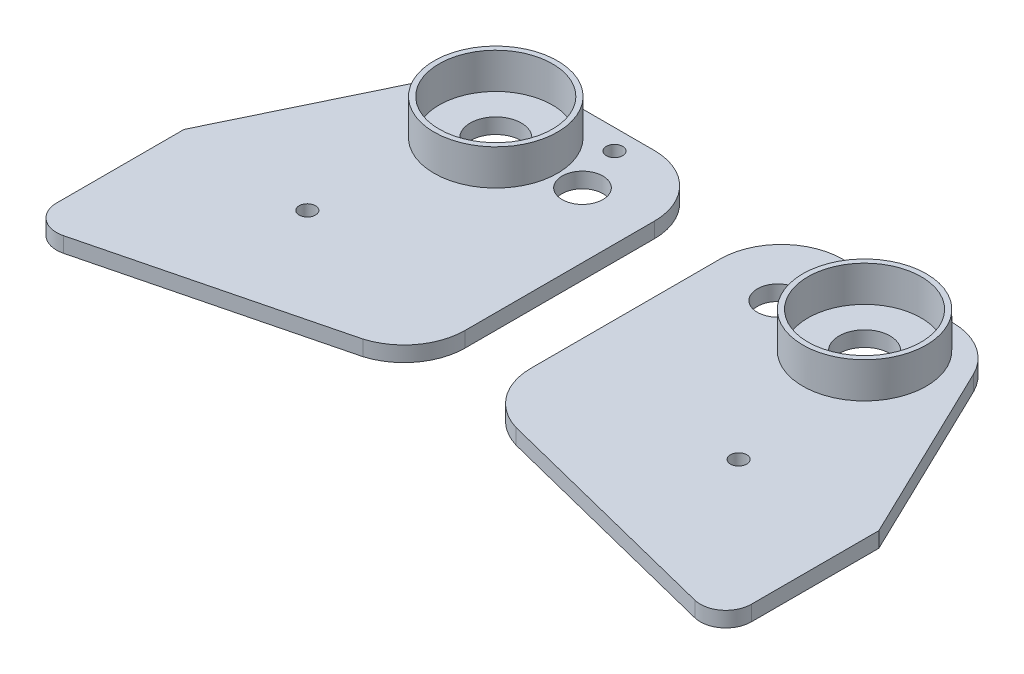
ISO-10303-21;
HEADER;
FILE_DESCRIPTION(('STEP AP214'),'2;1');
FILE_NAME('part.step','',(''),(''),'','','');
FILE_SCHEMA(('AUTOMOTIVE_DESIGN { 1 0 10303 214 1 1 1 1 }'));
ENDSEC;
DATA;
#1=APPLICATION_CONTEXT('core data for automotive mechanical design processes');
#2=APPLICATION_PROTOCOL_DEFINITION('international standard','automotive_design',2000,#1);
#3=PRODUCT_CONTEXT('',#1,'mechanical');
#4=PRODUCT('Part','Part','',(#3));
#5=PRODUCT_RELATED_PRODUCT_CATEGORY('part','',(#4));
#6=PRODUCT_DEFINITION_FORMATION('','',#4);
#7=PRODUCT_DEFINITION_CONTEXT('part definition',#1,'design');
#8=PRODUCT_DEFINITION('design','',#6,#7);
#9=PRODUCT_DEFINITION_SHAPE('','',#8);
#10=(LENGTH_UNIT() NAMED_UNIT(*) SI_UNIT(.MILLI.,.METRE.));
#11=(NAMED_UNIT(*) PLANE_ANGLE_UNIT() SI_UNIT($,.RADIAN.));
#12=(NAMED_UNIT(*) SI_UNIT($,.STERADIAN.) SOLID_ANGLE_UNIT());
#13=UNCERTAINTY_MEASURE_WITH_UNIT(LENGTH_MEASURE(1.E-05),#10,'distance_accuracy_value','');
#14=(GEOMETRIC_REPRESENTATION_CONTEXT(3) GLOBAL_UNCERTAINTY_ASSIGNED_CONTEXT((#13)) GLOBAL_UNIT_ASSIGNED_CONTEXT((#10,
#11,#12)) REPRESENTATION_CONTEXT('',''));
#15=CARTESIAN_POINT('',(0.,0.,0.));
#16=DIRECTION('',(0.,0.,1.));
#17=DIRECTION('',(1.,0.,0.));
#18=AXIS2_PLACEMENT_3D('',#15,#16,#17);
#19=CARTESIAN_POINT('',(40.042873565071,3.,-32.2165820237593));
#20=DIRECTION('',(0.,-1.,0.));
#21=DIRECTION('',(0.,0.,-1.));
#22=AXIS2_PLACEMENT_3D('',#19,#20,#21);
#23=PLANE('',#22);
#24=CARTESIAN_POINT('',(36.135474474537,3.,-30.8460471676936));
#25=DIRECTION('',(0.,1.,0.));
#26=DIRECTION('',(0.,0.,-1.));
#27=AXIS2_PLACEMENT_3D('',#24,#25,#26);
#28=CIRCLE('',#27,5.00000000000001);
#29=CARTESIAN_POINT('',(36.135474474537,3.,-35.8460471676936));
#30=VERTEX_POINT('',#29);
#31=EDGE_CURVE('E456',#30,#30,#28,.T.);
#32=ORIENTED_EDGE('',*,*,#31,.F.);
#33=EDGE_LOOP('',(#32));
#34=FACE_BOUND('',#33,.T.);
#35=CARTESIAN_POINT('',(36.135474474537,3.,-30.8460471676936));
#36=DIRECTION('',(0.,1.,0.));
#37=DIRECTION('',(0.,0.,1.));
#38=AXIS2_PLACEMENT_3D('',#35,#36,#37);
#39=CIRCLE('',#38,11.1);
#40=CARTESIAN_POINT('',(36.135474474537,3.,-19.7460471676936));
#41=VERTEX_POINT('',#40);
#42=EDGE_CURVE('E441',#41,#41,#39,.T.);
#43=ORIENTED_EDGE('',*,*,#42,.T.);
#44=EDGE_LOOP('',(#43));
#45=FACE_BOUND('',#44,.T.);
#46=ADVANCED_FACE('F49',(#34,#45),#23,.F.);
#47=CARTESIAN_POINT('',(22.2388305171554,3.,-40.2163712722587));
#48=DIRECTION('',(0.,1.,0.));
#49=DIRECTION('',(0.,0.,1.));
#50=AXIS2_PLACEMENT_3D('',#47,#48,#49);
#51=CIRCLE('',#50,1.6);
#52=CARTESIAN_POINT('',(22.2388305171554,3.,-38.6163712722587));
#53=VERTEX_POINT('',#52);
#54=EDGE_CURVE('E437',#53,#53,#51,.T.);
#55=ORIENTED_EDGE('',*,*,#54,.F.);
#56=EDGE_LOOP('',(#55));
#57=FACE_BOUND('',#56,.T.);
#58=CARTESIAN_POINT('',(36.135474474537,3.,-30.8460471676936));
#59=DIRECTION('',(0.,-1.,0.));
#60=DIRECTION('',(0.,0.,-1.));
#61=AXIS2_PLACEMENT_3D('',#58,#59,#60);
#62=CIRCLE('',#61,12.1);
#63=CARTESIAN_POINT('',(36.135474474537,3.,-42.9460471676936));
#64=VERTEX_POINT('',#63);
#65=EDGE_CURVE('E12',#64,#64,#62,.F.);
#66=ORIENTED_EDGE('',*,*,#65,.F.);
#67=EDGE_LOOP('',(#66));
#68=FACE_BOUND('',#67,.T.);
#69=CARTESIAN_POINT('',(40.042873565071,3.,-32.2165820237593));
#70=DIRECTION('',(0.,1.,0.));
#71=DIRECTION('',(0.,0.,-1.));
#72=AXIS2_PLACEMENT_3D('',#69,#70,#71);
#73=CIRCLE('',#72,12.000001);
#74=CARTESIAN_POINT('',(50.7602033417229,3.,-37.6146248596854));
#75=VERTEX_POINT('',#74);
#76=CARTESIAN_POINT('',(40.0427318384827,3.,-44.2165830229224));
#77=VERTEX_POINT('',#76);
#78=EDGE_CURVE('E194',#75,#77,#73,.T.);
#79=ORIENTED_EDGE('',*,*,#78,.T.);
#80=DIRECTION('',(-0.999999999929273,0.,1.18934820463317E-05));
#81=VECTOR('',#80,1.);
#82=CARTESIAN_POINT('',(18.4349291958282,3.,-44.2163260309096));
#83=LINE('',#82,#81);
#84=CARTESIAN_POINT('',(18.4349291958282,3.,-44.2163260309096));
#85=VERTEX_POINT('',#84);
#86=EDGE_CURVE('E117',#77,#85,#83,.T.);
#87=ORIENTED_EDGE('',*,*,#86,.T.);
#88=CARTESIAN_POINT('',(18.4350719174836,3.,-32.2163368976119));
#89=DIRECTION('',(0.,1.,0.));
#90=DIRECTION('',(0.,0.,-1.));
#91=AXIS2_PLACEMENT_3D('',#88,#89,#90);
#92=CIRCLE('',#91,11.9999883609759);
#93=CARTESIAN_POINT('',(6.43508355735918,3.,-32.2161939365774));
#94=VERTEX_POINT('',#93);
#95=EDGE_CURVE('E240',#85,#94,#92,.T.);
#96=ORIENTED_EDGE('',*,*,#95,.T.);
#97=DIRECTION('',(1.18627733153958E-05,0.,0.999999999929637));
#98=VECTOR('',#97,1.);
#99=CARTESIAN_POINT('',(6.43544644453697,3.,-1.69095353369363));
#100=LINE('',#99,#98);
#101=CARTESIAN_POINT('',(6.43544644453697,3.,-1.69095353369363));
#102=VERTEX_POINT('',#101);
#103=EDGE_CURVE('E236',#94,#102,#100,.T.);
#104=ORIENTED_EDGE('',*,*,#103,.T.);
#105=DIRECTION('',(1.19134310966162E-05,0.,0.999999999929035));
#106=VECTOR('',#105,1.);
#107=CARTESIAN_POINT('',(6.43544644453697,3.,-1.69095353369363));
#108=LINE('',#107,#106);
#109=CARTESIAN_POINT('',(6.43552431461504,3.,4.84537319138531));
#110=VERTEX_POINT('',#109);
#111=EDGE_CURVE('E238',#102,#110,#108,.T.);
#112=ORIENTED_EDGE('',*,*,#111,.T.);
#113=CARTESIAN_POINT('',(18.4355243137682,3.,4.84523062653266));
#114=DIRECTION('',(0.,1.,0.));
#115=DIRECTION('',(0.,0.,-1.));
#116=AXIS2_PLACEMENT_3D('',#113,#114,#115);
#117=CIRCLE('',#116,12.0000000000001);
#118=CARTESIAN_POINT('',(14.9998908917222,3.,16.3429009553132));
#119=VERTEX_POINT('',#118);
#120=EDGE_CURVE('E244',#110,#119,#117,.T.);
#121=ORIENTED_EDGE('',*,*,#120,.T.);
#122=DIRECTION('',(0.969769579192456,0.,0.244022464688983));
#123=VECTOR('',#122,1.);
#124=CARTESIAN_POINT('',(61.8646856411741,3.,28.1354576278246));
#125=LINE('',#124,#123);
#126=CARTESIAN_POINT('',(61.8646856411741,3.,28.1354576278246));
#127=VERTEX_POINT('',#126);
#128=EDGE_CURVE('E143',#119,#127,#125,.T.);
#129=ORIENTED_EDGE('',*,*,#128,.T.);
#130=CARTESIAN_POINT('',(63.084797964619,3.,23.2866097318623));
#131=DIRECTION('',(0.,1.,0.));
#132=DIRECTION('',(0.,0.,-1.));
#133=AXIS2_PLACEMENT_3D('',#130,#131,#132);
#134=CIRCLE('',#133,5.00000000000001);
#135=CARTESIAN_POINT('',(68.0847979636234,3.,23.2865099483779));
#136=VERTEX_POINT('',#135);
#137=EDGE_CURVE('E136',#127,#136,#134,.T.);
#138=ORIENTED_EDGE('',*,*,#137,.T.);
#139=DIRECTION('',(-1.99566968971164E-05,0.,-0.999999999800865));
#140=VECTOR('',#139,1.);
#141=CARTESIAN_POINT('',(68.0842992367222,3.,-1.70394331268686));
#142=LINE('',#141,#140);
#143=CARTESIAN_POINT('',(68.0842992367222,3.,-1.70394331268686));
#144=VERTEX_POINT('',#143);
#145=EDGE_CURVE('E141',#136,#144,#142,.T.);
#146=ORIENTED_EDGE('',*,*,#145,.T.);
#147=DIRECTION('',(-0.434503028481843,0.,-0.900670371578918));
#148=VECTOR('',#147,1.);
#149=CARTESIAN_POINT('',(50.7602033417229,3.,-37.6146248596854));
#150=LINE('',#149,#148);
#151=EDGE_CURVE('E67',#144,#75,#150,.T.);
#152=ORIENTED_EDGE('',*,*,#151,.T.);
#153=EDGE_LOOP('',(#79,#87,#96,#104,#112,#121,#129,#138,#146,#152));
#154=FACE_BOUND('',#153,.T.);
#155=CARTESIAN_POINT('',(42.260458862537,3.,-0.0416202926936254));
#156=DIRECTION('',(0.,1.,0.));
#157=DIRECTION('',(0.,0.,-1.));
#158=AXIS2_PLACEMENT_3D('',#155,#156,#157);
#159=CIRCLE('',#158,1.59999999999999);
#160=CARTESIAN_POINT('',(42.260458862537,3.,-1.64162029269362));
#161=VERTEX_POINT('',#160);
#162=EDGE_CURVE('E170',#161,#161,#159,.T.);
#163=ORIENTED_EDGE('',*,*,#162,.F.);
#164=EDGE_LOOP('',(#163));
#165=FACE_BOUND('',#164,.T.);
#166=CARTESIAN_POINT('',(19.135475969537,3.,-30.8419455666936));
#167=DIRECTION('',(0.,1.,0.));
#168=DIRECTION('',(0.,0.,-1.));
#169=AXIS2_PLACEMENT_3D('',#166,#167,#168);
#170=CIRCLE('',#169,4.00000000000001);
#171=CARTESIAN_POINT('',(19.135475969537,3.,-34.8419455666936));
#172=VERTEX_POINT('',#171);
#173=EDGE_CURVE('E464',#172,#172,#170,.T.);
#174=ORIENTED_EDGE('',*,*,#173,.F.);
#175=EDGE_LOOP('',(#174));
#176=FACE_BOUND('',#175,.T.);
#177=ADVANCED_FACE('F138',(#57,#68,#154,#165,#176),#23,.F.);
#178=CARTESIAN_POINT('',(40.042873565071,0.,-32.2165820237593));
#179=DIRECTION('',(0.,-1.,0.));
#180=DIRECTION('',(0.,0.,-1.));
#181=AXIS2_PLACEMENT_3D('',#178,#179,#180);
#182=PLANE('',#181);
#183=CARTESIAN_POINT('',(22.2388305171554,0.,-40.2163712722587));
#184=DIRECTION('',(0.,1.,0.));
#185=DIRECTION('',(0.,0.,1.));
#186=AXIS2_PLACEMENT_3D('',#183,#184,#185);
#187=CIRCLE('',#186,1.6);
#188=CARTESIAN_POINT('',(22.2388305171554,0.,-38.6163712722587));
#189=VERTEX_POINT('',#188);
#190=EDGE_CURVE('E434',#189,#189,#187,.T.);
#191=ORIENTED_EDGE('',*,*,#190,.T.);
#192=EDGE_LOOP('',(#191));
#193=FACE_BOUND('',#192,.T.);
#194=CARTESIAN_POINT('',(19.135475969537,0.,-30.8419455666936));
#195=DIRECTION('',(0.,1.,0.));
#196=DIRECTION('',(0.,0.,-1.));
#197=AXIS2_PLACEMENT_3D('',#194,#195,#196);
#198=CIRCLE('',#197,4.00000000000001);
#199=CARTESIAN_POINT('',(19.135475969537,0.,-34.8419455666936));
#200=VERTEX_POINT('',#199);
#201=EDGE_CURVE('E460',#200,#200,#198,.T.);
#202=ORIENTED_EDGE('',*,*,#201,.T.);
#203=EDGE_LOOP('',(#202));
#204=FACE_BOUND('',#203,.T.);
#205=CARTESIAN_POINT('',(40.042873565071,0.,-32.2165820237593));
#206=DIRECTION('',(0.,1.,0.));
#207=DIRECTION('',(0.,0.,-1.));
#208=AXIS2_PLACEMENT_3D('',#205,#206,#207);
#209=CIRCLE('',#208,12.000001);
#210=CARTESIAN_POINT('',(50.7602033417229,0.,-37.6146248596854));
#211=VERTEX_POINT('',#210);
#212=CARTESIAN_POINT('',(40.0427318384827,0.,-44.2165830229224));
#213=VERTEX_POINT('',#212);
#214=EDGE_CURVE('E165',#211,#213,#209,.T.);
#215=ORIENTED_EDGE('',*,*,#214,.F.);
#216=DIRECTION('',(-0.434503028481843,0.,-0.900670371578918));
#217=VECTOR('',#216,1.);
#218=CARTESIAN_POINT('',(50.7602033417229,0.,-37.6146248596854));
#219=LINE('',#218,#217);
#220=CARTESIAN_POINT('',(68.0842992367222,0.,-1.70394331268686));
#221=VERTEX_POINT('',#220);
#222=EDGE_CURVE('E108',#221,#211,#219,.T.);
#223=ORIENTED_EDGE('',*,*,#222,.F.);
#224=DIRECTION('',(-1.99566968971164E-05,0.,-0.999999999800865));
#225=VECTOR('',#224,1.);
#226=CARTESIAN_POINT('',(68.0842992367222,0.,-1.70394331268686));
#227=LINE('',#226,#225);
#228=CARTESIAN_POINT('',(68.0847979636234,0.,23.2865099483779));
#229=VERTEX_POINT('',#228);
#230=EDGE_CURVE('E102',#229,#221,#227,.T.);
#231=ORIENTED_EDGE('',*,*,#230,.F.);
#232=CARTESIAN_POINT('',(63.084797964619,0.,23.2866097318623));
#233=DIRECTION('',(0.,1.,0.));
#234=DIRECTION('',(0.,0.,-1.));
#235=AXIS2_PLACEMENT_3D('',#232,#233,#234);
#236=CIRCLE('',#235,5.00000000000001);
#237=CARTESIAN_POINT('',(61.8646856411741,0.,28.1354576278246));
#238=VERTEX_POINT('',#237);
#239=EDGE_CURVE('E152',#238,#229,#236,.T.);
#240=ORIENTED_EDGE('',*,*,#239,.F.);
#241=DIRECTION('',(0.969769579192456,0.,0.244022464688983));
#242=VECTOR('',#241,1.);
#243=CARTESIAN_POINT('',(61.8646856411741,0.,28.1354576278246));
#244=LINE('',#243,#242);
#245=CARTESIAN_POINT('',(14.9998908917222,0.,16.3429009553132));
#246=VERTEX_POINT('',#245);
#247=EDGE_CURVE('E185',#246,#238,#244,.T.);
#248=ORIENTED_EDGE('',*,*,#247,.F.);
#249=CARTESIAN_POINT('',(18.4355243137682,0.,4.84523062653266));
#250=DIRECTION('',(0.,1.,0.));
#251=DIRECTION('',(0.,0.,-1.));
#252=AXIS2_PLACEMENT_3D('',#249,#250,#251);
#253=CIRCLE('',#252,12.0000000000001);
#254=CARTESIAN_POINT('',(6.43552431461504,0.,4.84537319138531));
#255=VERTEX_POINT('',#254);
#256=EDGE_CURVE('E182',#255,#246,#253,.T.);
#257=ORIENTED_EDGE('',*,*,#256,.F.);
#258=DIRECTION('',(1.19134310966162E-05,0.,0.999999999929035));
#259=VECTOR('',#258,1.);
#260=CARTESIAN_POINT('',(6.43544644453697,0.,-1.69095353369363));
#261=LINE('',#260,#259);
#262=CARTESIAN_POINT('',(6.43544644453697,0.,-1.69095353369363));
#263=VERTEX_POINT('',#262);
#264=EDGE_CURVE('E179',#263,#255,#261,.T.);
#265=ORIENTED_EDGE('',*,*,#264,.F.);
#266=DIRECTION('',(1.18627733153958E-05,0.,0.999999999929637));
#267=VECTOR('',#266,1.);
#268=CARTESIAN_POINT('',(6.43544644453697,0.,-1.69095353369363));
#269=LINE('',#268,#267);
#270=CARTESIAN_POINT('',(6.43508355735918,0.,-32.2161939365774));
#271=VERTEX_POINT('',#270);
#272=EDGE_CURVE('E176',#271,#263,#269,.T.);
#273=ORIENTED_EDGE('',*,*,#272,.F.);
#274=CARTESIAN_POINT('',(18.4350719174836,0.,-32.2163368976119));
#275=DIRECTION('',(0.,1.,0.));
#276=DIRECTION('',(0.,0.,-1.));
#277=AXIS2_PLACEMENT_3D('',#274,#275,#276);
#278=CIRCLE('',#277,11.9999883609759);
#279=CARTESIAN_POINT('',(18.4349291958282,0.,-44.2163260309096));
#280=VERTEX_POINT('',#279);
#281=EDGE_CURVE('E173',#280,#271,#278,.T.);
#282=ORIENTED_EDGE('',*,*,#281,.F.);
#283=DIRECTION('',(-0.999999999929273,0.,1.18934820463317E-05));
#284=VECTOR('',#283,1.);
#285=CARTESIAN_POINT('',(18.4349291958282,0.,-44.2163260309096));
#286=LINE('',#285,#284);
#287=EDGE_CURVE('E169',#213,#280,#286,.T.);
#288=ORIENTED_EDGE('',*,*,#287,.F.);
#289=EDGE_LOOP('',(#215,#223,#231,#240,#248,#257,#265,#273,#282,#288));
#290=FACE_BOUND('',#289,.T.);
#291=CARTESIAN_POINT('',(42.260458862537,0.,-0.0416202926936254));
#292=DIRECTION('',(0.,1.,0.));
#293=DIRECTION('',(0.,0.,-1.));
#294=AXIS2_PLACEMENT_3D('',#291,#292,#293);
#295=CIRCLE('',#294,1.59999999999999);
#296=CARTESIAN_POINT('',(42.260458862537,0.,-1.64162029269362));
#297=VERTEX_POINT('',#296);
#298=EDGE_CURVE('E468',#297,#297,#295,.T.);
#299=ORIENTED_EDGE('',*,*,#298,.T.);
#300=EDGE_LOOP('',(#299));
#301=FACE_BOUND('',#300,.T.);
#302=CARTESIAN_POINT('',(36.135474474537,0.,-30.8460471676936));
#303=DIRECTION('',(0.,1.,0.));
#304=DIRECTION('',(0.,0.,-1.));
#305=AXIS2_PLACEMENT_3D('',#302,#303,#304);
#306=CIRCLE('',#305,5.00000000000001);
#307=CARTESIAN_POINT('',(36.135474474537,0.,-35.8460471676936));
#308=VERTEX_POINT('',#307);
#309=EDGE_CURVE('E455',#308,#308,#306,.T.);
#310=ORIENTED_EDGE('',*,*,#309,.T.);
#311=EDGE_LOOP('',(#310));
#312=FACE_BOUND('',#311,.T.);
#313=ADVANCED_FACE('F223',(#193,#204,#290,#301,#312),#182,.T.);
#314=CARTESIAN_POINT('',(40.042873565071,3.,-32.2165820237593));
#315=DIRECTION('',(0.,-1.,0.));
#316=DIRECTION('',(0.,0.,-1.));
#317=AXIS2_PLACEMENT_3D('',#314,#315,#316);
#318=CYLINDRICAL_SURFACE('',#317,12.000001);
#319=ORIENTED_EDGE('',*,*,#214,.T.);
#320=DIRECTION('',(0.,-1.,0.));
#321=VECTOR('',#320,1.);
#322=CARTESIAN_POINT('',(40.0427318384827,3.,-44.2165830229224));
#323=LINE('',#322,#321);
#324=EDGE_CURVE('E59',#77,#213,#323,.T.);
#325=ORIENTED_EDGE('',*,*,#324,.F.);
#326=ORIENTED_EDGE('',*,*,#78,.F.);
#327=DIRECTION('',(0.,-1.,0.));
#328=VECTOR('',#327,1.);
#329=CARTESIAN_POINT('',(50.7602033417229,3.,-37.6146248596854));
#330=LINE('',#329,#328);
#331=EDGE_CURVE('E161',#75,#211,#330,.T.);
#332=ORIENTED_EDGE('',*,*,#331,.T.);
#333=EDGE_LOOP('',(#319,#325,#326,#332));
#334=FACE_BOUND('',#333,.T.);
#335=ADVANCED_FACE('F51',(#334),#318,.T.);
#336=CARTESIAN_POINT('',(18.4349291958282,3.,-44.2163260309096));
#337=DIRECTION('',(1.18934820463317E-05,0.,0.999999999929273));
#338=DIRECTION('',(0.999999999929273,0.,-1.18934820463317E-05));
#339=AXIS2_PLACEMENT_3D('',#336,#337,#338);
#340=PLANE('',#339);
#341=ORIENTED_EDGE('',*,*,#287,.T.);
#342=DIRECTION('',(0.,-1.,0.));
#343=VECTOR('',#342,1.);
#344=CARTESIAN_POINT('',(18.4349291958282,3.,-44.2163260309096));
#345=LINE('',#344,#343);
#346=EDGE_CURVE('E213',#85,#280,#345,.T.);
#347=ORIENTED_EDGE('',*,*,#346,.F.);
#348=ORIENTED_EDGE('',*,*,#86,.F.);
#349=ORIENTED_EDGE('',*,*,#324,.T.);
#350=EDGE_LOOP('',(#341,#347,#348,#349));
#351=FACE_BOUND('',#350,.T.);
#352=ADVANCED_FACE('F218',(#351),#340,.F.);
#353=CARTESIAN_POINT('',(18.4350719174836,3.,-32.2163368976119));
#354=DIRECTION('',(0.,-1.,0.));
#355=DIRECTION('',(0.,0.,-1.));
#356=AXIS2_PLACEMENT_3D('',#353,#354,#355);
#357=CYLINDRICAL_SURFACE('',#356,11.9999883609759);
#358=ORIENTED_EDGE('',*,*,#281,.T.);
#359=DIRECTION('',(0.,-1.,0.));
#360=VECTOR('',#359,1.);
#361=CARTESIAN_POINT('',(6.43508355735918,3.,-32.2161939365774));
#362=LINE('',#361,#360);
#363=EDGE_CURVE('E209',#94,#271,#362,.T.);
#364=ORIENTED_EDGE('',*,*,#363,.F.);
#365=ORIENTED_EDGE('',*,*,#95,.F.);
#366=ORIENTED_EDGE('',*,*,#346,.T.);
#367=EDGE_LOOP('',(#358,#364,#365,#366));
#368=FACE_BOUND('',#367,.T.);
#369=ADVANCED_FACE('F230',(#368),#357,.T.);
#370=CARTESIAN_POINT('',(6.43544644453697,3.,-1.69095353369363));
#371=DIRECTION('',(0.999999999929035,0.,-1.19134310966162E-05));
#372=DIRECTION('',(-1.19134310966162E-05,0.,-0.999999999929035));
#373=AXIS2_PLACEMENT_3D('',#370,#371,#372);
#374=PLANE('',#373);
#375=ORIENTED_EDGE('',*,*,#264,.T.);
#376=DIRECTION('',(0.,-1.,0.));
#377=VECTOR('',#376,1.);
#378=CARTESIAN_POINT('',(6.43552431461504,3.,4.84537319138531));
#379=LINE('',#378,#377);
#380=EDGE_CURVE('E205',#110,#255,#379,.T.);
#381=ORIENTED_EDGE('',*,*,#380,.F.);
#382=ORIENTED_EDGE('',*,*,#111,.F.);
#383=ORIENTED_EDGE('',*,*,#103,.F.);
#384=ORIENTED_EDGE('',*,*,#363,.T.);
#385=ORIENTED_EDGE('',*,*,#272,.T.);
#386=EDGE_LOOP('',(#375,#381,#382,#383,#384,#385));
#387=FACE_BOUND('',#386,.T.);
#388=ADVANCED_FACE('F234',(#387),#374,.F.);
#389=CARTESIAN_POINT('',(18.4355243137682,3.,4.84523062653266));
#390=DIRECTION('',(0.,-1.,0.));
#391=DIRECTION('',(0.,0.,-1.));
#392=AXIS2_PLACEMENT_3D('',#389,#390,#391);
#393=CYLINDRICAL_SURFACE('',#392,12.0000000000001);
#394=ORIENTED_EDGE('',*,*,#256,.T.);
#395=DIRECTION('',(0.,-1.,0.));
#396=VECTOR('',#395,1.);
#397=CARTESIAN_POINT('',(14.9998908917222,3.,16.3429009553132));
#398=LINE('',#397,#396);
#399=EDGE_CURVE('E201',#119,#246,#398,.T.);
#400=ORIENTED_EDGE('',*,*,#399,.F.);
#401=ORIENTED_EDGE('',*,*,#120,.F.);
#402=ORIENTED_EDGE('',*,*,#380,.T.);
#403=EDGE_LOOP('',(#394,#400,#401,#402));
#404=FACE_BOUND('',#403,.T.);
#405=ADVANCED_FACE('F254',(#404),#393,.T.);
#406=CARTESIAN_POINT('',(61.8646856411741,3.,28.1354576278246));
#407=DIRECTION('',(0.244022464688983,0.,-0.969769579192457));
#408=DIRECTION('',(-0.969769579192457,0.,-0.244022464688983));
#409=AXIS2_PLACEMENT_3D('',#406,#407,#408);
#410=PLANE('',#409);
#411=ORIENTED_EDGE('',*,*,#247,.T.);
#412=DIRECTION('',(0.,-1.,0.));
#413=VECTOR('',#412,1.);
#414=CARTESIAN_POINT('',(61.8646856411741,3.,28.1354576278246));
#415=LINE('',#414,#413);
#416=EDGE_CURVE('E154',#127,#238,#415,.T.);
#417=ORIENTED_EDGE('',*,*,#416,.F.);
#418=ORIENTED_EDGE('',*,*,#128,.F.);
#419=ORIENTED_EDGE('',*,*,#399,.T.);
#420=EDGE_LOOP('',(#411,#417,#418,#419));
#421=FACE_BOUND('',#420,.T.);
#422=ADVANCED_FACE('F258',(#421),#410,.F.);
#423=CARTESIAN_POINT('',(63.084797964619,3.,23.2866097318623));
#424=DIRECTION('',(0.,-1.,0.));
#425=DIRECTION('',(0.,0.,-1.));
#426=AXIS2_PLACEMENT_3D('',#423,#424,#425);
#427=CYLINDRICAL_SURFACE('',#426,5.00000000000001);
#428=ORIENTED_EDGE('',*,*,#239,.T.);
#429=DIRECTION('',(0.,-1.,0.));
#430=VECTOR('',#429,1.);
#431=CARTESIAN_POINT('',(68.0847979636234,3.,23.2865099483779));
#432=LINE('',#431,#430);
#433=EDGE_CURVE('E149',#136,#229,#432,.T.);
#434=ORIENTED_EDGE('',*,*,#433,.F.);
#435=ORIENTED_EDGE('',*,*,#137,.F.);
#436=ORIENTED_EDGE('',*,*,#416,.T.);
#437=EDGE_LOOP('',(#428,#434,#435,#436));
#438=FACE_BOUND('',#437,.T.);
#439=ADVANCED_FACE('F150',(#438),#427,.T.);
#440=CARTESIAN_POINT('',(68.0842992367222,3.,-1.70394331268686));
#441=DIRECTION('',(-0.999999999800865,0.,1.99566968971164E-05));
#442=DIRECTION('',(1.99566968971164E-05,0.,0.999999999800865));
#443=AXIS2_PLACEMENT_3D('',#440,#441,#442);
#444=PLANE('',#443);
#445=ORIENTED_EDGE('',*,*,#230,.T.);
#446=DIRECTION('',(0.,-1.,0.));
#447=VECTOR('',#446,1.);
#448=CARTESIAN_POINT('',(68.0842992367222,3.,-1.70394331268686));
#449=LINE('',#448,#447);
#450=EDGE_CURVE('E155',#144,#221,#449,.T.);
#451=ORIENTED_EDGE('',*,*,#450,.F.);
#452=ORIENTED_EDGE('',*,*,#145,.F.);
#453=ORIENTED_EDGE('',*,*,#433,.T.);
#454=EDGE_LOOP('',(#445,#451,#452,#453));
#455=FACE_BOUND('',#454,.T.);
#456=ADVANCED_FACE('F157',(#455),#444,.F.);
#457=CARTESIAN_POINT('',(50.7602033417229,3.,-37.6146248596854));
#458=DIRECTION('',(-0.900670371578918,0.,0.434503028481843));
#459=DIRECTION('',(0.434503028481843,0.,0.900670371578918));
#460=AXIS2_PLACEMENT_3D('',#457,#458,#459);
#461=PLANE('',#460);
#462=ORIENTED_EDGE('',*,*,#222,.T.);
#463=ORIENTED_EDGE('',*,*,#331,.F.);
#464=ORIENTED_EDGE('',*,*,#151,.F.);
#465=ORIENTED_EDGE('',*,*,#450,.T.);
#466=EDGE_LOOP('',(#462,#463,#464,#465));
#467=FACE_BOUND('',#466,.T.);
#468=ADVANCED_FACE('F283',(#467),#461,.F.);
#469=CARTESIAN_POINT('',(42.260458862537,3.,-0.0416202926936254));
#470=DIRECTION('',(0.,-1.,0.));
#471=DIRECTION('',(0.,0.,-1.));
#472=AXIS2_PLACEMENT_3D('',#469,#470,#471);
#473=CYLINDRICAL_SURFACE('',#472,1.59999999999999);
#474=ORIENTED_EDGE('',*,*,#162,.T.);
#475=EDGE_LOOP('',(#474));
#476=FACE_BOUND('',#475,.T.);
#477=ORIENTED_EDGE('',*,*,#298,.F.);
#478=EDGE_LOOP('',(#477));
#479=FACE_BOUND('',#478,.T.);
#480=ADVANCED_FACE('F278',(#476,#479),#473,.F.);
#481=CARTESIAN_POINT('',(19.135475969537,3.,-30.8419455666936));
#482=DIRECTION('',(0.,-1.,0.));
#483=DIRECTION('',(0.,0.,-1.));
#484=AXIS2_PLACEMENT_3D('',#481,#482,#483);
#485=CYLINDRICAL_SURFACE('',#484,4.00000000000001);
#486=ORIENTED_EDGE('',*,*,#173,.T.);
#487=EDGE_LOOP('',(#486));
#488=FACE_BOUND('',#487,.T.);
#489=ORIENTED_EDGE('',*,*,#201,.F.);
#490=EDGE_LOOP('',(#489));
#491=FACE_BOUND('',#490,.T.);
#492=ADVANCED_FACE('F301',(#488,#491),#485,.F.);
#493=CARTESIAN_POINT('',(36.135474474537,3.,-30.8460471676936));
#494=DIRECTION('',(0.,-1.,0.));
#495=DIRECTION('',(0.,0.,-1.));
#496=AXIS2_PLACEMENT_3D('',#493,#494,#495);
#497=CYLINDRICAL_SURFACE('',#496,5.00000000000001);
#498=ORIENTED_EDGE('',*,*,#31,.T.);
#499=EDGE_LOOP('',(#498));
#500=FACE_BOUND('',#499,.T.);
#501=ORIENTED_EDGE('',*,*,#309,.F.);
#502=EDGE_LOOP('',(#501));
#503=FACE_BOUND('',#502,.T.);
#504=ADVANCED_FACE('F308',(#500,#503),#497,.F.);
#505=CARTESIAN_POINT('',(36.135474474537,10.,-30.8460471676936));
#506=DIRECTION('',(0.,1.,0.));
#507=DIRECTION('',(0.,0.,1.));
#508=AXIS2_PLACEMENT_3D('',#505,#506,#507);
#509=PLANE('',#508);
#510=CARTESIAN_POINT('',(36.135474474537,10.,-30.8460471676936));
#511=DIRECTION('',(0.,1.,0.));
#512=DIRECTION('',(0.,0.,1.));
#513=AXIS2_PLACEMENT_3D('',#510,#511,#512);
#514=CIRCLE('',#513,12.1);
#515=CARTESIAN_POINT('',(36.135474474537,10.,-18.7460471676936));
#516=VERTEX_POINT('',#515);
#517=EDGE_CURVE('E448',#516,#516,#514,.T.);
#518=ORIENTED_EDGE('',*,*,#517,.T.);
#519=EDGE_LOOP('',(#518));
#520=FACE_BOUND('',#519,.T.);
#521=CARTESIAN_POINT('',(36.135474474537,10.,-30.8460471676936));
#522=DIRECTION('',(0.,1.,0.));
#523=DIRECTION('',(0.,0.,1.));
#524=AXIS2_PLACEMENT_3D('',#521,#522,#523);
#525=CIRCLE('',#524,11.1);
#526=CARTESIAN_POINT('',(36.135474474537,10.,-19.7460471676936));
#527=VERTEX_POINT('',#526);
#528=EDGE_CURVE('E444',#527,#527,#525,.T.);
#529=ORIENTED_EDGE('',*,*,#528,.F.);
#530=EDGE_LOOP('',(#529));
#531=FACE_BOUND('',#530,.T.);
#532=ADVANCED_FACE('F315',(#520,#531),#509,.T.);
#533=CARTESIAN_POINT('',(36.135474474537,10.,-30.8460471676936));
#534=DIRECTION('',(0.,-1.,0.));
#535=DIRECTION('',(0.,0.,-1.));
#536=AXIS2_PLACEMENT_3D('',#533,#534,#535);
#537=CYLINDRICAL_SURFACE('',#536,12.1);
#538=ORIENTED_EDGE('',*,*,#517,.F.);
#539=EDGE_LOOP('',(#538));
#540=FACE_BOUND('',#539,.T.);
#541=ORIENTED_EDGE('',*,*,#65,.T.);
#542=EDGE_LOOP('',(#541));
#543=FACE_BOUND('',#542,.T.);
#544=ADVANCED_FACE('F323',(#540,#543),#537,.T.);
#545=CARTESIAN_POINT('',(36.135474474537,10.,-30.8460471676936));
#546=DIRECTION('',(0.,-1.,0.));
#547=DIRECTION('',(0.,0.,-1.));
#548=AXIS2_PLACEMENT_3D('',#545,#546,#547);
#549=CYLINDRICAL_SURFACE('',#548,11.1);
#550=ORIENTED_EDGE('',*,*,#528,.T.);
#551=EDGE_LOOP('',(#550));
#552=FACE_BOUND('',#551,.T.);
#553=ORIENTED_EDGE('',*,*,#42,.F.);
#554=EDGE_LOOP('',(#553));
#555=FACE_BOUND('',#554,.T.);
#556=ADVANCED_FACE('F331',(#552,#555),#549,.F.);
#557=CARTESIAN_POINT('',(22.2388305171554,0.,-40.2163712722587));
#558=DIRECTION('',(0.,1.,0.));
#559=DIRECTION('',(0.,0.,1.));
#560=AXIS2_PLACEMENT_3D('',#557,#558,#559);
#561=CYLINDRICAL_SURFACE('',#560,1.6);
#562=ORIENTED_EDGE('',*,*,#190,.F.);
#563=EDGE_LOOP('',(#562));
#564=FACE_BOUND('',#563,.T.);
#565=ORIENTED_EDGE('',*,*,#54,.T.);
#566=EDGE_LOOP('',(#565));
#567=FACE_BOUND('',#566,.T.);
#568=ADVANCED_FACE('F339',(#564,#567),#561,.F.);
#569=CLOSED_SHELL('',(#46,#177,#313,#335,#352,#369,#388,#405,#422,#439,#456,#468,#480,#492,#504,
#532,#544,#556,#568));
#570=MANIFOLD_SOLID_BREP('B2',#569);
#571=CARTESIAN_POINT('',(-18.4355243137682,3.,4.84523062653266));
#572=DIRECTION('',(0.,1.,0.));
#573=DIRECTION('',(0.,0.,1.));
#574=AXIS2_PLACEMENT_3D('',#571,#572,#573);
#575=PLANE('',#574);
#576=CARTESIAN_POINT('',(-36.135474474537,3.,-30.8460471676936));
#577=DIRECTION('',(0.,1.,0.));
#578=DIRECTION('',(0.,0.,1.));
#579=AXIS2_PLACEMENT_3D('',#576,#577,#578);
#580=CIRCLE('',#579,5.00000000000001);
#581=CARTESIAN_POINT('',(-36.135474474537,3.,-25.8460471676936));
#582=VERTEX_POINT('',#581);
#583=EDGE_CURVE('E617',#582,#582,#580,.T.);
#584=ORIENTED_EDGE('',*,*,#583,.F.);
#585=EDGE_LOOP('',(#584));
#586=FACE_BOUND('',#585,.T.);
#587=CARTESIAN_POINT('',(-36.135474474537,3.,-30.8460471676936));
#588=DIRECTION('',(0.,1.,0.));
#589=DIRECTION('',(0.,0.,1.));
#590=AXIS2_PLACEMENT_3D('',#587,#588,#589);
#591=CIRCLE('',#590,11.1);
#592=CARTESIAN_POINT('',(-36.135474474537,3.,-19.7460471676936));
#593=VERTEX_POINT('',#592);
#594=EDGE_CURVE('E47',#593,#593,#591,.F.);
#595=ORIENTED_EDGE('',*,*,#594,.F.);
#596=EDGE_LOOP('',(#595));
#597=FACE_BOUND('',#596,.T.);
#598=ADVANCED_FACE('F502',(#586,#597),#575,.T.);
#599=CARTESIAN_POINT('',(-22.2388305171554,3.,-40.2163712722587));
#600=DIRECTION('',(0.,1.,0.));
#601=DIRECTION('',(0.,0.,1.));
#602=AXIS2_PLACEMENT_3D('',#599,#600,#601);
#603=CIRCLE('',#602,1.6);
#604=CARTESIAN_POINT('',(-22.2388305171554,3.,-38.6163712722587));
#605=VERTEX_POINT('',#604);
#606=EDGE_CURVE('E862',#605,#605,#603,.T.);
#607=ORIENTED_EDGE('',*,*,#606,.F.);
#608=EDGE_LOOP('',(#607));
#609=FACE_BOUND('',#608,.T.);
#610=CARTESIAN_POINT('',(-36.135474474537,3.,-30.8460471676936));
#611=DIRECTION('',(0.,1.,0.));
#612=DIRECTION('',(0.,0.,1.));
#613=AXIS2_PLACEMENT_3D('',#610,#611,#612);
#614=CIRCLE('',#613,12.1);
#615=CARTESIAN_POINT('',(-36.135474474537,3.,-18.7460471676936));
#616=VERTEX_POINT('',#615);
#617=EDGE_CURVE('E869',#616,#616,#614,.T.);
#618=ORIENTED_EDGE('',*,*,#617,.F.);
#619=EDGE_LOOP('',(#618));
#620=FACE_BOUND('',#619,.T.);
#621=CARTESIAN_POINT('',(-19.135475969537,3.,-30.8419455666936));
#622=DIRECTION('',(0.,1.,0.));
#623=DIRECTION('',(0.,0.,1.));
#624=AXIS2_PLACEMENT_3D('',#621,#622,#623);
#625=CIRCLE('',#624,4.00000000000001);
#626=CARTESIAN_POINT('',(-19.135475969537,3.,-26.8419455666936));
#627=VERTEX_POINT('',#626);
#628=EDGE_CURVE('E882',#627,#627,#625,.T.);
#629=ORIENTED_EDGE('',*,*,#628,.F.);
#630=EDGE_LOOP('',(#629));
#631=FACE_BOUND('',#630,.T.);
#632=CARTESIAN_POINT('',(-18.4355243137682,3.,4.84523062653266));
#633=DIRECTION('',(0.,1.,0.));
#634=DIRECTION('',(0.,0.,1.));
#635=AXIS2_PLACEMENT_3D('',#632,#633,#634);
#636=CIRCLE('',#635,12.);
#637=CARTESIAN_POINT('',(-14.9998908917222,3.,16.3429009553132));
#638=VERTEX_POINT('',#637);
#639=CARTESIAN_POINT('',(-6.43552431461504,3.,4.84537319138531));
#640=VERTEX_POINT('',#639);
#641=EDGE_CURVE('E632',#638,#640,#636,.T.);
#642=ORIENTED_EDGE('',*,*,#641,.T.);
#643=DIRECTION('',(1.19134310966162E-05,0.,-0.999999999929035));
#644=VECTOR('',#643,1.);
#645=CARTESIAN_POINT('',(-6.43544644453697,3.,-1.69095353369363));
#646=LINE('',#645,#644);
#647=CARTESIAN_POINT('',(-6.43544644453697,3.,-1.69095353369363));
#648=VERTEX_POINT('',#647);
#649=EDGE_CURVE('E569',#640,#648,#646,.T.);
#650=ORIENTED_EDGE('',*,*,#649,.T.);
#651=DIRECTION('',(1.18627733153958E-05,0.,-0.999999999929637));
#652=VECTOR('',#651,1.);
#653=CARTESIAN_POINT('',(-6.43544644453697,3.,-1.69095353369363));
#654=LINE('',#653,#652);
#655=CARTESIAN_POINT('',(-6.43508355735917,3.,-32.2161939365774));
#656=VERTEX_POINT('',#655);
#657=EDGE_CURVE('E666',#648,#656,#654,.T.);
#658=ORIENTED_EDGE('',*,*,#657,.T.);
#659=CARTESIAN_POINT('',(-18.4350719174835,3.,-32.2163368976119));
#660=DIRECTION('',(0.,1.,0.));
#661=DIRECTION('',(0.,0.,1.));
#662=AXIS2_PLACEMENT_3D('',#659,#660,#661);
#663=CIRCLE('',#662,11.9999883609759);
#664=CARTESIAN_POINT('',(-18.4349291958282,3.,-44.2163260309096));
#665=VERTEX_POINT('',#664);
#666=EDGE_CURVE('E663',#656,#665,#663,.T.);
#667=ORIENTED_EDGE('',*,*,#666,.T.);
#668=DIRECTION('',(-0.999999999929273,0.,-1.18934820463317E-05));
#669=VECTOR('',#668,1.);
#670=CARTESIAN_POINT('',(-18.4349291958282,3.,-44.2163260309096));
#671=LINE('',#670,#669);
#672=CARTESIAN_POINT('',(-40.0427318384827,3.,-44.2165830229224));
#673=VERTEX_POINT('',#672);
#674=EDGE_CURVE('E665',#665,#673,#671,.T.);
#675=ORIENTED_EDGE('',*,*,#674,.T.);
#676=CARTESIAN_POINT('',(-40.042873565071,3.,-32.2165820237593));
#677=DIRECTION('',(0.,1.,0.));
#678=DIRECTION('',(0.,0.,1.));
#679=AXIS2_PLACEMENT_3D('',#676,#677,#678);
#680=CIRCLE('',#679,12.000001);
#681=CARTESIAN_POINT('',(-50.7602033417229,3.,-37.6146248596853));
#682=VERTEX_POINT('',#681);
#683=EDGE_CURVE('E668',#673,#682,#680,.T.);
#684=ORIENTED_EDGE('',*,*,#683,.T.);
#685=DIRECTION('',(-0.434503028481843,0.,0.900670371578919));
#686=VECTOR('',#685,1.);
#687=CARTESIAN_POINT('',(-50.7602033417229,3.,-37.6146248596853));
#688=LINE('',#687,#686);
#689=CARTESIAN_POINT('',(-68.0842992367222,3.,-1.70394331268685));
#690=VERTEX_POINT('',#689);
#691=EDGE_CURVE('E595',#682,#690,#688,.T.);
#692=ORIENTED_EDGE('',*,*,#691,.T.);
#693=DIRECTION('',(-1.99566968971164E-05,0.,0.999999999800865));
#694=VECTOR('',#693,1.);
#695=CARTESIAN_POINT('',(-68.0842992367222,3.,-1.70394331268685));
#696=LINE('',#695,#694);
#697=CARTESIAN_POINT('',(-68.0847979636233,3.,23.2865099483779));
#698=VERTEX_POINT('',#697);
#699=EDGE_CURVE('E588',#690,#698,#696,.T.);
#700=ORIENTED_EDGE('',*,*,#699,.T.);
#701=CARTESIAN_POINT('',(-63.084797964619,3.,23.2866097318624));
#702=DIRECTION('',(0.,1.,0.));
#703=DIRECTION('',(0.,0.,1.));
#704=AXIS2_PLACEMENT_3D('',#701,#702,#703);
#705=CIRCLE('',#704,5.00000000000001);
#706=CARTESIAN_POINT('',(-61.8646856411741,3.,28.1354576278246));
#707=VERTEX_POINT('',#706);
#708=EDGE_CURVE('E593',#698,#707,#705,.T.);
#709=ORIENTED_EDGE('',*,*,#708,.T.);
#710=DIRECTION('',(0.969769579192457,0.,-0.244022464688983));
#711=VECTOR('',#710,1.);
#712=CARTESIAN_POINT('',(-61.8646856411741,3.,28.1354576278246));
#713=LINE('',#712,#711);
#714=EDGE_CURVE('E519',#707,#638,#713,.T.);
#715=ORIENTED_EDGE('',*,*,#714,.T.);
#716=EDGE_LOOP('',(#642,#650,#658,#667,#675,#684,#692,#700,#709,#715));
#717=FACE_BOUND('',#716,.T.);
#718=CARTESIAN_POINT('',(-42.260458862537,3.,-0.0416202926936254));
#719=DIRECTION('',(0.,1.,0.));
#720=DIRECTION('',(0.,0.,1.));
#721=AXIS2_PLACEMENT_3D('',#718,#719,#720);
#722=CIRCLE('',#721,1.59999999999999);
#723=CARTESIAN_POINT('',(-42.260458862537,3.,1.55837970730637));
#724=VERTEX_POINT('',#723);
#725=EDGE_CURVE('E876',#724,#724,#722,.T.);
#726=ORIENTED_EDGE('',*,*,#725,.F.);
#727=EDGE_LOOP('',(#726));
#728=FACE_BOUND('',#727,.T.);
#729=ADVANCED_FACE('F590',(#609,#620,#631,#717,#728),#575,.T.);
#730=CARTESIAN_POINT('',(-18.4355243137682,0.,4.84523062653266));
#731=DIRECTION('',(0.,1.,0.));
#732=DIRECTION('',(0.,0.,1.));
#733=AXIS2_PLACEMENT_3D('',#730,#731,#732);
#734=PLANE('',#733);
#735=CARTESIAN_POINT('',(-22.2388305171554,0.,-40.2163712722587));
#736=DIRECTION('',(0.,1.,0.));
#737=DIRECTION('',(0.,0.,1.));
#738=AXIS2_PLACEMENT_3D('',#735,#736,#737);
#739=CIRCLE('',#738,1.6);
#740=CARTESIAN_POINT('',(-22.2388305171554,0.,-38.6163712722587));
#741=VERTEX_POINT('',#740);
#742=EDGE_CURVE('E859',#741,#741,#739,.T.);
#743=ORIENTED_EDGE('',*,*,#742,.T.);
#744=EDGE_LOOP('',(#743));
#745=FACE_BOUND('',#744,.T.);
#746=CARTESIAN_POINT('',(-18.4355243137682,0.,4.84523062653266));
#747=DIRECTION('',(0.,1.,0.));
#748=DIRECTION('',(0.,0.,1.));
#749=AXIS2_PLACEMENT_3D('',#746,#747,#748);
#750=CIRCLE('',#749,12.);
#751=CARTESIAN_POINT('',(-14.9998908917222,0.,16.3429009553132));
#752=VERTEX_POINT('',#751);
#753=CARTESIAN_POINT('',(-6.43552431461504,0.,4.84537319138531));
#754=VERTEX_POINT('',#753);
#755=EDGE_CURVE('E613',#752,#754,#750,.T.);
#756=ORIENTED_EDGE('',*,*,#755,.F.);
#757=DIRECTION('',(0.969769579192457,0.,-0.244022464688983));
#758=VECTOR('',#757,1.);
#759=CARTESIAN_POINT('',(-61.8646856411741,0.,28.1354576278246));
#760=LINE('',#759,#758);
#761=CARTESIAN_POINT('',(-61.8646856411741,0.,28.1354576278246));
#762=VERTEX_POINT('',#761);
#763=EDGE_CURVE('E560',#762,#752,#760,.T.);
#764=ORIENTED_EDGE('',*,*,#763,.F.);
#765=CARTESIAN_POINT('',(-63.084797964619,0.,23.2866097318624));
#766=DIRECTION('',(0.,1.,0.));
#767=DIRECTION('',(0.,0.,1.));
#768=AXIS2_PLACEMENT_3D('',#765,#766,#767);
#769=CIRCLE('',#768,5.00000000000001);
#770=CARTESIAN_POINT('',(-68.0847979636233,0.,23.2865099483779));
#771=VERTEX_POINT('',#770);
#772=EDGE_CURVE('E554',#771,#762,#769,.T.);
#773=ORIENTED_EDGE('',*,*,#772,.F.);
#774=DIRECTION('',(-1.99566968971164E-05,0.,0.999999999800865));
#775=VECTOR('',#774,1.);
#776=CARTESIAN_POINT('',(-68.0842992367222,0.,-1.70394331268685));
#777=LINE('',#776,#775);
#778=CARTESIAN_POINT('',(-68.0842992367222,0.,-1.70394331268685));
#779=VERTEX_POINT('',#778);
#780=EDGE_CURVE('E603',#779,#771,#777,.T.);
#781=ORIENTED_EDGE('',*,*,#780,.F.);
#782=DIRECTION('',(-0.434503028481843,0.,0.900670371578919));
#783=VECTOR('',#782,1.);
#784=CARTESIAN_POINT('',(-50.7602033417229,0.,-37.6146248596853));
#785=LINE('',#784,#783);
#786=CARTESIAN_POINT('',(-50.7602033417229,0.,-37.6146248596853));
#787=VERTEX_POINT('',#786);
#788=EDGE_CURVE('E627',#787,#779,#785,.T.);
#789=ORIENTED_EDGE('',*,*,#788,.F.);
#790=CARTESIAN_POINT('',(-40.042873565071,0.,-32.2165820237593));
#791=DIRECTION('',(0.,1.,0.));
#792=DIRECTION('',(0.,0.,1.));
#793=AXIS2_PLACEMENT_3D('',#790,#791,#792);
#794=CIRCLE('',#793,12.000001);
#795=CARTESIAN_POINT('',(-40.0427318384827,0.,-44.2165830229224));
#796=VERTEX_POINT('',#795);
#797=EDGE_CURVE('E625',#796,#787,#794,.T.);
#798=ORIENTED_EDGE('',*,*,#797,.F.);
#799=DIRECTION('',(-0.999999999929273,0.,-1.18934820463317E-05));
#800=VECTOR('',#799,1.);
#801=CARTESIAN_POINT('',(-18.4349291958282,0.,-44.2163260309096));
#802=LINE('',#801,#800);
#803=CARTESIAN_POINT('',(-18.4349291958282,0.,-44.2163260309096));
#804=VERTEX_POINT('',#803);
#805=EDGE_CURVE('E623',#804,#796,#802,.T.);
#806=ORIENTED_EDGE('',*,*,#805,.F.);
#807=CARTESIAN_POINT('',(-18.4350719174835,0.,-32.2163368976119));
#808=DIRECTION('',(0.,1.,0.));
#809=DIRECTION('',(0.,0.,1.));
#810=AXIS2_PLACEMENT_3D('',#807,#808,#809);
#811=CIRCLE('',#810,11.9999883609759);
#812=CARTESIAN_POINT('',(-6.43508355735917,0.,-32.2161939365774));
#813=VERTEX_POINT('',#812);
#814=EDGE_CURVE('E621',#813,#804,#811,.T.);
#815=ORIENTED_EDGE('',*,*,#814,.F.);
#816=DIRECTION('',(1.18627733153958E-05,0.,-0.999999999929637));
#817=VECTOR('',#816,1.);
#818=CARTESIAN_POINT('',(-6.43544644453697,0.,-1.69095353369363));
#819=LINE('',#818,#817);
#820=CARTESIAN_POINT('',(-6.43544644453697,0.,-1.69095353369363));
#821=VERTEX_POINT('',#820);
#822=EDGE_CURVE('E619',#821,#813,#819,.T.);
#823=ORIENTED_EDGE('',*,*,#822,.F.);
#824=DIRECTION('',(1.19134310966162E-05,0.,-0.999999999929035));
#825=VECTOR('',#824,1.);
#826=CARTESIAN_POINT('',(-6.43544644453697,0.,-1.69095353369363));
#827=LINE('',#826,#825);
#828=EDGE_CURVE('E616',#754,#821,#827,.T.);
#829=ORIENTED_EDGE('',*,*,#828,.F.);
#830=EDGE_LOOP('',(#756,#764,#773,#781,#789,#798,#806,#815,#823,#829));
#831=FACE_BOUND('',#830,.T.);
#832=CARTESIAN_POINT('',(-36.135474474537,0.,-30.8460471676936));
#833=DIRECTION('',(0.,1.,0.));
#834=DIRECTION('',(0.,0.,1.));
#835=AXIS2_PLACEMENT_3D('',#832,#833,#834);
#836=CIRCLE('',#835,5.00000000000001);
#837=CARTESIAN_POINT('',(-36.135474474537,0.,-25.8460471676936));
#838=VERTEX_POINT('',#837);
#839=EDGE_CURVE('E885',#838,#838,#836,.T.);
#840=ORIENTED_EDGE('',*,*,#839,.T.);
#841=EDGE_LOOP('',(#840));
#842=FACE_BOUND('',#841,.T.);
#843=CARTESIAN_POINT('',(-19.135475969537,0.,-30.8419455666936));
#844=DIRECTION('',(0.,1.,0.));
#845=DIRECTION('',(0.,0.,1.));
#846=AXIS2_PLACEMENT_3D('',#843,#844,#845);
#847=CIRCLE('',#846,4.00000000000001);
#848=CARTESIAN_POINT('',(-19.135475969537,0.,-26.8419455666936));
#849=VERTEX_POINT('',#848);
#850=EDGE_CURVE('E879',#849,#849,#847,.T.);
#851=ORIENTED_EDGE('',*,*,#850,.T.);
#852=EDGE_LOOP('',(#851));
#853=FACE_BOUND('',#852,.T.);
#854=CARTESIAN_POINT('',(-42.260458862537,0.,-0.0416202926936254));
#855=DIRECTION('',(0.,1.,0.));
#856=DIRECTION('',(0.,0.,1.));
#857=AXIS2_PLACEMENT_3D('',#854,#855,#856);
#858=CIRCLE('',#857,1.59999999999999);
#859=CARTESIAN_POINT('',(-42.260458862537,0.,1.55837970730637));
#860=VERTEX_POINT('',#859);
#861=EDGE_CURVE('E873',#860,#860,#858,.T.);
#862=ORIENTED_EDGE('',*,*,#861,.T.);
#863=EDGE_LOOP('',(#862));
#864=FACE_BOUND('',#863,.T.);
#865=ADVANCED_FACE('F654',(#745,#831,#842,#853,#864),#734,.F.);
#866=CARTESIAN_POINT('',(-18.4355243137682,3.,4.84523062653266));
#867=DIRECTION('',(0.,-1.,0.));
#868=DIRECTION('',(0.,0.,-1.));
#869=AXIS2_PLACEMENT_3D('',#866,#867,#868);
#870=CYLINDRICAL_SURFACE('',#869,12.);
#871=ORIENTED_EDGE('',*,*,#755,.T.);
#872=DIRECTION('',(0.,-1.,0.));
#873=VECTOR('',#872,1.);
#874=CARTESIAN_POINT('',(-6.43552431461504,3.,4.84537319138531));
#875=LINE('',#874,#873);
#876=EDGE_CURVE('E511',#640,#754,#875,.T.);
#877=ORIENTED_EDGE('',*,*,#876,.F.);
#878=ORIENTED_EDGE('',*,*,#641,.F.);
#879=DIRECTION('',(0.,-1.,0.));
#880=VECTOR('',#879,1.);
#881=CARTESIAN_POINT('',(-14.9998908917222,3.,16.3429009553132));
#882=LINE('',#881,#880);
#883=EDGE_CURVE('E609',#638,#752,#882,.T.);
#884=ORIENTED_EDGE('',*,*,#883,.T.);
#885=EDGE_LOOP('',(#871,#877,#878,#884));
#886=FACE_BOUND('',#885,.T.);
#887=ADVANCED_FACE('F504',(#886),#870,.T.);
#888=CARTESIAN_POINT('',(-6.43544644453697,3.,-1.69095353369363));
#889=DIRECTION('',(-0.999999999929637,0.,-1.18627733153958E-05));
#890=DIRECTION('',(-1.18627733153958E-05,0.,0.999999999929637));
#891=AXIS2_PLACEMENT_3D('',#888,#889,#890);
#892=PLANE('',#891);
#893=ORIENTED_EDGE('',*,*,#822,.T.);
#894=DIRECTION('',(0.,-1.,0.));
#895=VECTOR('',#894,1.);
#896=CARTESIAN_POINT('',(-6.43508355735917,3.,-32.2161939365774));
#897=LINE('',#896,#895);
#898=EDGE_CURVE('E645',#656,#813,#897,.T.);
#899=ORIENTED_EDGE('',*,*,#898,.F.);
#900=ORIENTED_EDGE('',*,*,#657,.F.);
#901=ORIENTED_EDGE('',*,*,#649,.F.);
#902=ORIENTED_EDGE('',*,*,#876,.T.);
#903=ORIENTED_EDGE('',*,*,#828,.T.);
#904=EDGE_LOOP('',(#893,#899,#900,#901,#902,#903));
#905=FACE_BOUND('',#904,.T.);
#906=ADVANCED_FACE('F648',(#905),#892,.F.);
#907=CARTESIAN_POINT('',(-18.4350719174835,3.,-32.2163368976119));
#908=DIRECTION('',(0.,-1.,0.));
#909=DIRECTION('',(0.,0.,-1.));
#910=AXIS2_PLACEMENT_3D('',#907,#908,#909);
#911=CYLINDRICAL_SURFACE('',#910,11.9999883609759);
#912=ORIENTED_EDGE('',*,*,#814,.T.);
#913=DIRECTION('',(0.,-1.,0.));
#914=VECTOR('',#913,1.);
#915=CARTESIAN_POINT('',(-18.4349291958282,3.,-44.2163260309096));
#916=LINE('',#915,#914);
#917=EDGE_CURVE('E642',#665,#804,#916,.T.);
#918=ORIENTED_EDGE('',*,*,#917,.F.);
#919=ORIENTED_EDGE('',*,*,#666,.F.);
#920=ORIENTED_EDGE('',*,*,#898,.T.);
#921=EDGE_LOOP('',(#912,#918,#919,#920));
#922=FACE_BOUND('',#921,.T.);
#923=ADVANCED_FACE('F661',(#922),#911,.T.);
#924=CARTESIAN_POINT('',(-18.4349291958282,3.,-44.2163260309096));
#925=DIRECTION('',(-1.18934820463317E-05,0.,0.999999999929273));
#926=DIRECTION('',(0.999999999929273,0.,1.18934820463317E-05));
#927=AXIS2_PLACEMENT_3D('',#924,#925,#926);
#928=PLANE('',#927);
#929=ORIENTED_EDGE('',*,*,#805,.T.);
#930=DIRECTION('',(0.,-1.,0.));
#931=VECTOR('',#930,1.);
#932=CARTESIAN_POINT('',(-40.0427318384827,3.,-44.2165830229224));
#933=LINE('',#932,#931);
#934=EDGE_CURVE('E639',#673,#796,#933,.T.);
#935=ORIENTED_EDGE('',*,*,#934,.F.);
#936=ORIENTED_EDGE('',*,*,#674,.F.);
#937=ORIENTED_EDGE('',*,*,#917,.T.);
#938=EDGE_LOOP('',(#929,#935,#936,#937));
#939=FACE_BOUND('',#938,.T.);
#940=ADVANCED_FACE('F683',(#939),#928,.F.);
#941=CARTESIAN_POINT('',(-40.042873565071,3.,-32.2165820237593));
#942=DIRECTION('',(0.,-1.,0.));
#943=DIRECTION('',(0.,0.,-1.));
#944=AXIS2_PLACEMENT_3D('',#941,#942,#943);
#945=CYLINDRICAL_SURFACE('',#944,12.000001);
#946=ORIENTED_EDGE('',*,*,#797,.T.);
#947=DIRECTION('',(0.,-1.,0.));
#948=VECTOR('',#947,1.);
#949=CARTESIAN_POINT('',(-50.7602033417229,3.,-37.6146248596853));
#950=LINE('',#949,#948);
#951=EDGE_CURVE('E636',#682,#787,#950,.T.);
#952=ORIENTED_EDGE('',*,*,#951,.F.);
#953=ORIENTED_EDGE('',*,*,#683,.F.);
#954=ORIENTED_EDGE('',*,*,#934,.T.);
#955=EDGE_LOOP('',(#946,#952,#953,#954));
#956=FACE_BOUND('',#955,.T.);
#957=ADVANCED_FACE('F677',(#956),#945,.T.);
#958=CARTESIAN_POINT('',(-50.7602033417229,3.,-37.6146248596853));
#959=DIRECTION('',(0.900670371578918,0.,0.434503028481842));
#960=DIRECTION('',(0.434503028481843,0.,-0.900670371578919));
#961=AXIS2_PLACEMENT_3D('',#958,#959,#960);
#962=PLANE('',#961);
#963=ORIENTED_EDGE('',*,*,#788,.T.);
#964=DIRECTION('',(0.,-1.,0.));
#965=VECTOR('',#964,1.);
#966=CARTESIAN_POINT('',(-68.0842992367222,3.,-1.70394331268685));
#967=LINE('',#966,#965);
#968=EDGE_CURVE('E604',#690,#779,#967,.T.);
#969=ORIENTED_EDGE('',*,*,#968,.F.);
#970=ORIENTED_EDGE('',*,*,#691,.F.);
#971=ORIENTED_EDGE('',*,*,#951,.T.);
#972=EDGE_LOOP('',(#963,#969,#970,#971));
#973=FACE_BOUND('',#972,.T.);
#974=ADVANCED_FACE('F681',(#973),#962,.F.);
#975=CARTESIAN_POINT('',(-68.0842992367222,3.,-1.70394331268685));
#976=DIRECTION('',(0.999999999800865,0.,1.99566968971164E-05));
#977=DIRECTION('',(1.99566968971164E-05,0.,-0.999999999800865));
#978=AXIS2_PLACEMENT_3D('',#975,#976,#977);
#979=PLANE('',#978);
#980=ORIENTED_EDGE('',*,*,#780,.T.);
#981=DIRECTION('',(0.,-1.,0.));
#982=VECTOR('',#981,1.);
#983=CARTESIAN_POINT('',(-68.0847979636233,3.,23.2865099483779));
#984=LINE('',#983,#982);
#985=EDGE_CURVE('E600',#698,#771,#984,.T.);
#986=ORIENTED_EDGE('',*,*,#985,.F.);
#987=ORIENTED_EDGE('',*,*,#699,.F.);
#988=ORIENTED_EDGE('',*,*,#968,.T.);
#989=EDGE_LOOP('',(#980,#986,#987,#988));
#990=FACE_BOUND('',#989,.T.);
#991=ADVANCED_FACE('F601',(#990),#979,.F.);
#992=CARTESIAN_POINT('',(-63.084797964619,3.,23.2866097318624));
#993=DIRECTION('',(0.,-1.,0.));
#994=DIRECTION('',(0.,0.,-1.));
#995=AXIS2_PLACEMENT_3D('',#992,#993,#994);
#996=CYLINDRICAL_SURFACE('',#995,5.00000000000001);
#997=ORIENTED_EDGE('',*,*,#772,.T.);
#998=DIRECTION('',(0.,-1.,0.));
#999=VECTOR('',#998,1.);
#1000=CARTESIAN_POINT('',(-61.8646856411741,3.,28.1354576278246));
#1001=LINE('',#1000,#999);
#1002=EDGE_CURVE('E605',#707,#762,#1001,.T.);
#1003=ORIENTED_EDGE('',*,*,#1002,.F.);
#1004=ORIENTED_EDGE('',*,*,#708,.F.);
#1005=ORIENTED_EDGE('',*,*,#985,.T.);
#1006=EDGE_LOOP('',(#997,#1003,#1004,#1005));
#1007=FACE_BOUND('',#1006,.T.);
#1008=ADVANCED_FACE('F607',(#1007),#996,.T.);
#1009=CARTESIAN_POINT('',(-61.8646856411741,3.,28.1354576278246));
#1010=DIRECTION('',(-0.244022464688983,0.,-0.969769579192456));
#1011=DIRECTION('',(-0.969769579192457,0.,0.244022464688983));
#1012=AXIS2_PLACEMENT_3D('',#1009,#1010,#1011);
#1013=PLANE('',#1012);
#1014=ORIENTED_EDGE('',*,*,#763,.T.);
#1015=ORIENTED_EDGE('',*,*,#883,.F.);
#1016=ORIENTED_EDGE('',*,*,#714,.F.);
#1017=ORIENTED_EDGE('',*,*,#1002,.T.);
#1018=EDGE_LOOP('',(#1014,#1015,#1016,#1017));
#1019=FACE_BOUND('',#1018,.T.);
#1020=ADVANCED_FACE('F708',(#1019),#1013,.F.);
#1021=CARTESIAN_POINT('',(-36.135474474537,3.,-30.8460471676936));
#1022=DIRECTION('',(0.,-1.,0.));
#1023=DIRECTION('',(0.,0.,-1.));
#1024=AXIS2_PLACEMENT_3D('',#1021,#1022,#1023);
#1025=CYLINDRICAL_SURFACE('',#1024,5.00000000000001);
#1026=ORIENTED_EDGE('',*,*,#583,.T.);
#1027=EDGE_LOOP('',(#1026));
#1028=FACE_BOUND('',#1027,.T.);
#1029=ORIENTED_EDGE('',*,*,#839,.F.);
#1030=EDGE_LOOP('',(#1029));
#1031=FACE_BOUND('',#1030,.T.);
#1032=ADVANCED_FACE('F703',(#1028,#1031),#1025,.F.);
#1033=CARTESIAN_POINT('',(-19.135475969537,3.,-30.8419455666936));
#1034=DIRECTION('',(0.,-1.,0.));
#1035=DIRECTION('',(0.,0.,-1.));
#1036=AXIS2_PLACEMENT_3D('',#1033,#1034,#1035);
#1037=CYLINDRICAL_SURFACE('',#1036,4.00000000000001);
#1038=ORIENTED_EDGE('',*,*,#628,.T.);
#1039=EDGE_LOOP('',(#1038));
#1040=FACE_BOUND('',#1039,.T.);
#1041=ORIENTED_EDGE('',*,*,#850,.F.);
#1042=EDGE_LOOP('',(#1041));
#1043=FACE_BOUND('',#1042,.T.);
#1044=ADVANCED_FACE('F738',(#1040,#1043),#1037,.F.);
#1045=CARTESIAN_POINT('',(-42.260458862537,3.,-0.0416202926936254));
#1046=DIRECTION('',(0.,-1.,0.));
#1047=DIRECTION('',(0.,0.,-1.));
#1048=AXIS2_PLACEMENT_3D('',#1045,#1046,#1047);
#1049=CYLINDRICAL_SURFACE('',#1048,1.59999999999999);
#1050=ORIENTED_EDGE('',*,*,#725,.T.);
#1051=EDGE_LOOP('',(#1050));
#1052=FACE_BOUND('',#1051,.T.);
#1053=ORIENTED_EDGE('',*,*,#861,.F.);
#1054=EDGE_LOOP('',(#1053));
#1055=FACE_BOUND('',#1054,.T.);
#1056=ADVANCED_FACE('F745',(#1052,#1055),#1049,.F.);
#1057=CARTESIAN_POINT('',(-36.135474474537,10.,-30.8460471676936));
#1058=DIRECTION('',(0.,1.,0.));
#1059=DIRECTION('',(0.,0.,1.));
#1060=AXIS2_PLACEMENT_3D('',#1057,#1058,#1059);
#1061=PLANE('',#1060);
#1062=CARTESIAN_POINT('',(-36.135474474537,10.,-30.8460471676936));
#1063=DIRECTION('',(0.,1.,0.));
#1064=DIRECTION('',(0.,0.,1.));
#1065=AXIS2_PLACEMENT_3D('',#1062,#1063,#1064);
#1066=CIRCLE('',#1065,12.1);
#1067=CARTESIAN_POINT('',(-36.135474474537,10.,-18.7460471676936));
#1068=VERTEX_POINT('',#1067);
#1069=EDGE_CURVE('E870',#1068,#1068,#1066,.T.);
#1070=ORIENTED_EDGE('',*,*,#1069,.T.);
#1071=EDGE_LOOP('',(#1070));
#1072=FACE_BOUND('',#1071,.T.);
#1073=CARTESIAN_POINT('',(-36.135474474537,10.,-30.8460471676936));
#1074=DIRECTION('',(0.,1.,0.));
#1075=DIRECTION('',(0.,0.,1.));
#1076=AXIS2_PLACEMENT_3D('',#1073,#1074,#1075);
#1077=CIRCLE('',#1076,11.1);
#1078=CARTESIAN_POINT('',(-36.135474474537,10.,-19.7460471676936));
#1079=VERTEX_POINT('',#1078);
#1080=EDGE_CURVE('E864',#1079,#1079,#1077,.T.);
#1081=ORIENTED_EDGE('',*,*,#1080,.F.);
#1082=EDGE_LOOP('',(#1081));
#1083=FACE_BOUND('',#1082,.T.);
#1084=ADVANCED_FACE('F752',(#1072,#1083),#1061,.T.);
#1085=CARTESIAN_POINT('',(-36.135474474537,10.,-30.8460471676936));
#1086=DIRECTION('',(0.,-1.,0.));
#1087=DIRECTION('',(0.,0.,-1.));
#1088=AXIS2_PLACEMENT_3D('',#1085,#1086,#1087);
#1089=CYLINDRICAL_SURFACE('',#1088,12.1);
#1090=ORIENTED_EDGE('',*,*,#1069,.F.);
#1091=EDGE_LOOP('',(#1090));
#1092=FACE_BOUND('',#1091,.T.);
#1093=ORIENTED_EDGE('',*,*,#617,.T.);
#1094=EDGE_LOOP('',(#1093));
#1095=FACE_BOUND('',#1094,.T.);
#1096=ADVANCED_FACE('F760',(#1092,#1095),#1089,.T.);
#1097=CARTESIAN_POINT('',(-36.135474474537,10.,-30.8460471676936));
#1098=DIRECTION('',(0.,-1.,0.));
#1099=DIRECTION('',(0.,0.,-1.));
#1100=AXIS2_PLACEMENT_3D('',#1097,#1098,#1099);
#1101=CYLINDRICAL_SURFACE('',#1100,11.1);
#1102=ORIENTED_EDGE('',*,*,#1080,.T.);
#1103=EDGE_LOOP('',(#1102));
#1104=FACE_BOUND('',#1103,.T.);
#1105=ORIENTED_EDGE('',*,*,#594,.T.);
#1106=EDGE_LOOP('',(#1105));
#1107=FACE_BOUND('',#1106,.T.);
#1108=ADVANCED_FACE('F768',(#1104,#1107),#1101,.F.);
#1109=CARTESIAN_POINT('',(-22.2388305171554,0.,-40.2163712722587));
#1110=DIRECTION('',(0.,1.,0.));
#1111=DIRECTION('',(0.,0.,1.));
#1112=AXIS2_PLACEMENT_3D('',#1109,#1110,#1111);
#1113=CYLINDRICAL_SURFACE('',#1112,1.6);
#1114=ORIENTED_EDGE('',*,*,#742,.F.);
#1115=EDGE_LOOP('',(#1114));
#1116=FACE_BOUND('',#1115,.T.);
#1117=ORIENTED_EDGE('',*,*,#606,.T.);
#1118=EDGE_LOOP('',(#1117));
#1119=FACE_BOUND('',#1118,.T.);
#1120=ADVANCED_FACE('F776',(#1116,#1119),#1113,.F.);
#1121=CLOSED_SHELL('',(#598,#729,#865,#887,#906,#923,#940,#957,#974,#991,#1008,#1020,#1032,
#1044,#1056,#1084,#1096,#1108,#1120));
#1122=MANIFOLD_SOLID_BREP('B6',#1121);
#1123=ADVANCED_BREP_SHAPE_REPRESENTATION('',(#18,#570,#1122),#14);
#1124=SHAPE_DEFINITION_REPRESENTATION(#9,#1123);
ENDSEC;
END-ISO-10303-21;
